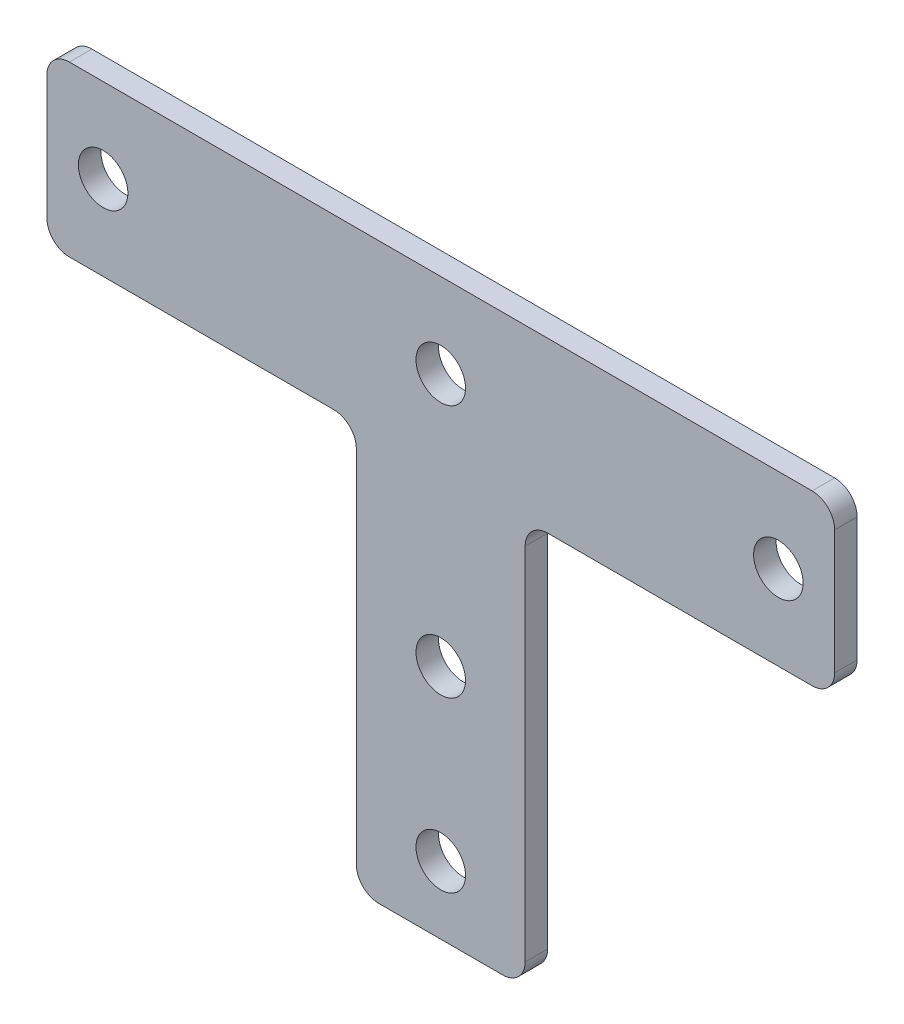
ISO-10303-21;
HEADER;
FILE_DESCRIPTION(('STEP AP214'),'2;1');
FILE_NAME('part.step','',(''),(''),'','','');
FILE_SCHEMA(('AUTOMOTIVE_DESIGN { 1 0 10303 214 1 1 1 1 }'));
ENDSEC;
DATA;
#1=APPLICATION_CONTEXT('core data for automotive mechanical design processes');
#2=APPLICATION_PROTOCOL_DEFINITION('international standard','automotive_design',2000,#1);
#3=PRODUCT_CONTEXT('',#1,'mechanical');
#4=PRODUCT('Part','Part','',(#3));
#5=PRODUCT_RELATED_PRODUCT_CATEGORY('part','',(#4));
#6=PRODUCT_DEFINITION_FORMATION('','',#4);
#7=PRODUCT_DEFINITION_CONTEXT('part definition',#1,'design');
#8=PRODUCT_DEFINITION('design','',#6,#7);
#9=PRODUCT_DEFINITION_SHAPE('','',#8);
#10=(LENGTH_UNIT() NAMED_UNIT(*) SI_UNIT(.MILLI.,.METRE.));
#11=(NAMED_UNIT(*) PLANE_ANGLE_UNIT() SI_UNIT($,.RADIAN.));
#12=(NAMED_UNIT(*) SI_UNIT($,.STERADIAN.) SOLID_ANGLE_UNIT());
#13=UNCERTAINTY_MEASURE_WITH_UNIT(LENGTH_MEASURE(1.E-05),#10,'distance_accuracy_value','');
#14=(GEOMETRIC_REPRESENTATION_CONTEXT(3) GLOBAL_UNCERTAINTY_ASSIGNED_CONTEXT((#13)) GLOBAL_UNIT_ASSIGNED_CONTEXT((#10,
#11,#12)) REPRESENTATION_CONTEXT('',''));
#15=CARTESIAN_POINT('',(0.,0.,0.));
#16=DIRECTION('',(0.,0.,1.));
#17=DIRECTION('',(1.,0.,0.));
#18=AXIS2_PLACEMENT_3D('',#15,#16,#17);
#19=CARTESIAN_POINT('',(0.,-15.,2.));
#20=DIRECTION('',(0.,1.,0.));
#21=DIRECTION('',(0.,0.,1.));
#22=AXIS2_PLACEMENT_3D('',#19,#20,#21);
#23=PLANE('',#22);
#24=DIRECTION('',(1.,0.,0.));
#25=VECTOR('',#24,1.);
#26=CARTESIAN_POINT('',(0.,-15.,2.));
#27=LINE('',#26,#25);
#28=CARTESIAN_POINT('',(2.,-15.,2.));
#29=VERTEX_POINT('',#28);
#30=CARTESIAN_POINT('',(25.5,-15.,2.));
#31=VERTEX_POINT('',#30);
#32=EDGE_CURVE('E322',#29,#31,#27,.T.);
#33=ORIENTED_EDGE('',*,*,#32,.F.);
#34=DIRECTION('',(0.,0.,-1.));
#35=VECTOR('',#34,1.);
#36=CARTESIAN_POINT('',(2.,-15.,2.));
#37=LINE('',#36,#35);
#38=CARTESIAN_POINT('',(2.,-15.,0.));
#39=VERTEX_POINT('',#38);
#40=EDGE_CURVE('E241',#29,#39,#37,.T.);
#41=ORIENTED_EDGE('',*,*,#40,.T.);
#42=DIRECTION('',(1.,0.,0.));
#43=VECTOR('',#42,1.);
#44=CARTESIAN_POINT('',(0.,-15.,0.));
#45=LINE('',#44,#43);
#46=CARTESIAN_POINT('',(25.5,-15.,0.));
#47=VERTEX_POINT('',#46);
#48=EDGE_CURVE('E296',#39,#47,#45,.T.);
#49=ORIENTED_EDGE('',*,*,#48,.T.);
#50=DIRECTION('',(0.,0.,-1.));
#51=VECTOR('',#50,1.);
#52=CARTESIAN_POINT('',(25.5,-15.,2.));
#53=LINE('',#52,#51);
#54=EDGE_CURVE('E243',#47,#31,#53,.F.);
#55=ORIENTED_EDGE('',*,*,#54,.T.);
#56=EDGE_LOOP('',(#33,#41,#49,#55));
#57=FACE_BOUND('',#56,.T.);
#58=ADVANCED_FACE('F42',(#57),#23,.F.);
#59=CARTESIAN_POINT('',(27.5,0.,2.));
#60=DIRECTION('',(1.,0.,0.));
#61=DIRECTION('',(0.,1.,0.));
#62=AXIS2_PLACEMENT_3D('',#59,#60,#61);
#63=PLANE('',#62);
#64=DIRECTION('',(0.,-1.,0.));
#65=VECTOR('',#64,1.);
#66=CARTESIAN_POINT('',(27.5,0.,0.));
#67=LINE('',#66,#65);
#68=CARTESIAN_POINT('',(27.5,-17.,0.));
#69=VERTEX_POINT('',#68);
#70=CARTESIAN_POINT('',(27.5,-49.,0.));
#71=VERTEX_POINT('',#70);
#72=EDGE_CURVE('E301',#69,#71,#67,.T.);
#73=ORIENTED_EDGE('',*,*,#72,.T.);
#74=DIRECTION('',(0.,0.,-1.));
#75=VECTOR('',#74,1.);
#76=CARTESIAN_POINT('',(27.5,-49.,2.));
#77=LINE('',#76,#75);
#78=CARTESIAN_POINT('',(27.5,-49.,2.));
#79=VERTEX_POINT('',#78);
#80=EDGE_CURVE('E231',#71,#79,#77,.F.);
#81=ORIENTED_EDGE('',*,*,#80,.T.);
#82=DIRECTION('',(0.,-1.,0.));
#83=VECTOR('',#82,1.);
#84=CARTESIAN_POINT('',(27.5,0.,2.));
#85=LINE('',#84,#83);
#86=CARTESIAN_POINT('',(27.5,-17.,2.));
#87=VERTEX_POINT('',#86);
#88=EDGE_CURVE('E328',#87,#79,#85,.T.);
#89=ORIENTED_EDGE('',*,*,#88,.F.);
#90=DIRECTION('',(0.,0.,-1.));
#91=VECTOR('',#90,1.);
#92=CARTESIAN_POINT('',(27.5,-17.,0.));
#93=LINE('',#92,#91);
#94=EDGE_CURVE('E234',#87,#69,#93,.T.);
#95=ORIENTED_EDGE('',*,*,#94,.T.);
#96=EDGE_LOOP('',(#73,#81,#89,#95));
#97=FACE_BOUND('',#96,.T.);
#98=ADVANCED_FACE('F349',(#97),#63,.F.);
#99=CARTESIAN_POINT('',(0.,-51.,2.));
#100=DIRECTION('',(0.,1.,0.));
#101=DIRECTION('',(0.,0.,1.));
#102=AXIS2_PLACEMENT_3D('',#99,#100,#101);
#103=PLANE('',#102);
#104=DIRECTION('',(1.,0.,0.));
#105=VECTOR('',#104,1.);
#106=CARTESIAN_POINT('',(0.,-51.,0.));
#107=LINE('',#106,#105);
#108=CARTESIAN_POINT('',(29.5,-51.,0.));
#109=VERTEX_POINT('',#108);
#110=CARTESIAN_POINT('',(40.5,-51.,0.));
#111=VERTEX_POINT('',#110);
#112=EDGE_CURVE('E265',#109,#111,#107,.T.);
#113=ORIENTED_EDGE('',*,*,#112,.T.);
#114=DIRECTION('',(0.,0.,-1.));
#115=VECTOR('',#114,1.);
#116=CARTESIAN_POINT('',(40.5,-51.,2.));
#117=LINE('',#116,#115);
#118=CARTESIAN_POINT('',(40.5,-51.,2.));
#119=VERTEX_POINT('',#118);
#120=EDGE_CURVE('E227',#111,#119,#117,.F.);
#121=ORIENTED_EDGE('',*,*,#120,.T.);
#122=DIRECTION('',(1.,0.,0.));
#123=VECTOR('',#122,1.);
#124=CARTESIAN_POINT('',(0.,-51.,2.));
#125=LINE('',#124,#123);
#126=CARTESIAN_POINT('',(29.5,-51.,2.));
#127=VERTEX_POINT('',#126);
#128=EDGE_CURVE('E276',#127,#119,#125,.T.);
#129=ORIENTED_EDGE('',*,*,#128,.F.);
#130=DIRECTION('',(0.,0.,-1.));
#131=VECTOR('',#130,1.);
#132=CARTESIAN_POINT('',(29.5,-51.,2.));
#133=LINE('',#132,#131);
#134=EDGE_CURVE('E230',#127,#109,#133,.T.);
#135=ORIENTED_EDGE('',*,*,#134,.T.);
#136=EDGE_LOOP('',(#113,#121,#129,#135));
#137=FACE_BOUND('',#136,.T.);
#138=ADVANCED_FACE('F342',(#137),#103,.F.);
#139=CARTESIAN_POINT('',(42.5,0.,2.));
#140=DIRECTION('',(1.,0.,0.));
#141=DIRECTION('',(0.,1.,0.));
#142=AXIS2_PLACEMENT_3D('',#139,#140,#141);
#143=PLANE('',#142);
#144=DIRECTION('',(0.,-1.,0.));
#145=VECTOR('',#144,1.);
#146=CARTESIAN_POINT('',(42.5,0.,2.));
#147=LINE('',#146,#145);
#148=CARTESIAN_POINT('',(42.5,-17.,2.));
#149=VERTEX_POINT('',#148);
#150=CARTESIAN_POINT('',(42.5,-49.,2.));
#151=VERTEX_POINT('',#150);
#152=EDGE_CURVE('E271',#149,#151,#147,.T.);
#153=ORIENTED_EDGE('',*,*,#152,.T.);
#154=DIRECTION('',(0.,0.,-1.));
#155=VECTOR('',#154,1.);
#156=CARTESIAN_POINT('',(42.5,-49.,0.));
#157=LINE('',#156,#155);
#158=CARTESIAN_POINT('',(42.5,-49.,0.));
#159=VERTEX_POINT('',#158);
#160=EDGE_CURVE('E221',#151,#159,#157,.T.);
#161=ORIENTED_EDGE('',*,*,#160,.T.);
#162=DIRECTION('',(0.,-1.,0.));
#163=VECTOR('',#162,1.);
#164=CARTESIAN_POINT('',(42.5,0.,0.));
#165=LINE('',#164,#163);
#166=CARTESIAN_POINT('',(42.5,-17.,0.));
#167=VERTEX_POINT('',#166);
#168=EDGE_CURVE('E252',#167,#159,#165,.T.);
#169=ORIENTED_EDGE('',*,*,#168,.F.);
#170=DIRECTION('',(0.,0.,-1.));
#171=VECTOR('',#170,1.);
#172=CARTESIAN_POINT('',(42.5,-17.,2.));
#173=LINE('',#172,#171);
#174=EDGE_CURVE('E225',#167,#149,#173,.F.);
#175=ORIENTED_EDGE('',*,*,#174,.T.);
#176=EDGE_LOOP('',(#153,#161,#169,#175));
#177=FACE_BOUND('',#176,.T.);
#178=ADVANCED_FACE('F259',(#177),#143,.T.);
#179=CARTESIAN_POINT('',(0.,-15.,2.));
#180=DIRECTION('',(0.,1.,0.));
#181=DIRECTION('',(0.,0.,1.));
#182=AXIS2_PLACEMENT_3D('',#179,#180,#181);
#183=PLANE('',#182);
#184=DIRECTION('',(1.,0.,0.));
#185=VECTOR('',#184,1.);
#186=CARTESIAN_POINT('',(0.,-15.,0.));
#187=LINE('',#186,#185);
#188=CARTESIAN_POINT('',(44.5,-15.,0.));
#189=VERTEX_POINT('',#188);
#190=CARTESIAN_POINT('',(68.,-15.,0.));
#191=VERTEX_POINT('',#190);
#192=EDGE_CURVE('E176',#189,#191,#187,.T.);
#193=ORIENTED_EDGE('',*,*,#192,.T.);
#194=DIRECTION('',(0.,0.,-1.));
#195=VECTOR('',#194,1.);
#196=CARTESIAN_POINT('',(68.,-15.,2.));
#197=LINE('',#196,#195);
#198=CARTESIAN_POINT('',(68.,-15.,2.));
#199=VERTEX_POINT('',#198);
#200=EDGE_CURVE('E206',#191,#199,#197,.F.);
#201=ORIENTED_EDGE('',*,*,#200,.T.);
#202=DIRECTION('',(1.,0.,0.));
#203=VECTOR('',#202,1.);
#204=CARTESIAN_POINT('',(0.,-15.,2.));
#205=LINE('',#204,#203);
#206=CARTESIAN_POINT('',(44.5,-15.,2.));
#207=VERTEX_POINT('',#206);
#208=EDGE_CURVE('E267',#207,#199,#205,.T.);
#209=ORIENTED_EDGE('',*,*,#208,.F.);
#210=DIRECTION('',(0.,0.,-1.));
#211=VECTOR('',#210,1.);
#212=CARTESIAN_POINT('',(44.5,-15.,2.));
#213=LINE('',#212,#211);
#214=EDGE_CURVE('E201',#207,#189,#213,.T.);
#215=ORIENTED_EDGE('',*,*,#214,.T.);
#216=EDGE_LOOP('',(#193,#201,#209,#215));
#217=FACE_BOUND('',#216,.T.);
#218=ADVANCED_FACE('F272',(#217),#183,.F.);
#219=CARTESIAN_POINT('',(70.,0.,2.));
#220=DIRECTION('',(1.,0.,0.));
#221=DIRECTION('',(0.,0.,-1.));
#222=AXIS2_PLACEMENT_3D('',#219,#220,#221);
#223=PLANE('',#222);
#224=DIRECTION('',(0.,-1.,0.));
#225=VECTOR('',#224,1.);
#226=CARTESIAN_POINT('',(70.,0.,2.));
#227=LINE('',#226,#225);
#228=CARTESIAN_POINT('',(70.,-2.,2.));
#229=VERTEX_POINT('',#228);
#230=CARTESIAN_POINT('',(70.,-13.,2.));
#231=VERTEX_POINT('',#230);
#232=EDGE_CURVE('E274',#229,#231,#227,.T.);
#233=ORIENTED_EDGE('',*,*,#232,.T.);
#234=DIRECTION('',(0.,0.,-1.));
#235=VECTOR('',#234,1.);
#236=CARTESIAN_POINT('',(70.,-13.,0.));
#237=LINE('',#236,#235);
#238=CARTESIAN_POINT('',(70.,-13.,0.));
#239=VERTEX_POINT('',#238);
#240=EDGE_CURVE('E180',#231,#239,#237,.T.);
#241=ORIENTED_EDGE('',*,*,#240,.T.);
#242=DIRECTION('',(0.,-1.,0.));
#243=VECTOR('',#242,1.);
#244=CARTESIAN_POINT('',(70.,0.,0.));
#245=LINE('',#244,#243);
#246=CARTESIAN_POINT('',(70.,-2.,0.));
#247=VERTEX_POINT('',#246);
#248=EDGE_CURVE('E165',#247,#239,#245,.T.);
#249=ORIENTED_EDGE('',*,*,#248,.F.);
#250=DIRECTION('',(0.,0.,-1.));
#251=VECTOR('',#250,1.);
#252=CARTESIAN_POINT('',(70.,-2.,2.));
#253=LINE('',#252,#251);
#254=EDGE_CURVE('E178',#247,#229,#253,.F.);
#255=ORIENTED_EDGE('',*,*,#254,.T.);
#256=EDGE_LOOP('',(#233,#241,#249,#255));
#257=FACE_BOUND('',#256,.T.);
#258=ADVANCED_FACE('F172',(#257),#223,.T.);
#259=CARTESIAN_POINT('',(0.,0.,2.));
#260=DIRECTION('',(0.,1.,0.));
#261=DIRECTION('',(0.,0.,1.));
#262=AXIS2_PLACEMENT_3D('',#259,#260,#261);
#263=PLANE('',#262);
#264=DIRECTION('',(1.,0.,0.));
#265=VECTOR('',#264,1.);
#266=CARTESIAN_POINT('',(0.,0.,2.));
#267=LINE('',#266,#265);
#268=CARTESIAN_POINT('',(2.,0.,2.));
#269=VERTEX_POINT('',#268);
#270=CARTESIAN_POINT('',(68.,0.,2.));
#271=VERTEX_POINT('',#270);
#272=EDGE_CURVE('E280',#269,#271,#267,.T.);
#273=ORIENTED_EDGE('',*,*,#272,.T.);
#274=DIRECTION('',(0.,0.,-1.));
#275=VECTOR('',#274,1.);
#276=CARTESIAN_POINT('',(68.,0.,2.));
#277=LINE('',#276,#275);
#278=CARTESIAN_POINT('',(68.,0.,0.));
#279=VERTEX_POINT('',#278);
#280=EDGE_CURVE('E219',#271,#279,#277,.T.);
#281=ORIENTED_EDGE('',*,*,#280,.T.);
#282=DIRECTION('',(1.,0.,0.));
#283=VECTOR('',#282,1.);
#284=CARTESIAN_POINT('',(0.,0.,0.));
#285=LINE('',#284,#283);
#286=CARTESIAN_POINT('',(2.,0.,0.));
#287=VERTEX_POINT('',#286);
#288=EDGE_CURVE('E163',#287,#279,#285,.T.);
#289=ORIENTED_EDGE('',*,*,#288,.F.);
#290=DIRECTION('',(0.,0.,-1.));
#291=VECTOR('',#290,1.);
#292=CARTESIAN_POINT('',(2.,0.,2.));
#293=LINE('',#292,#291);
#294=EDGE_CURVE('E217',#287,#269,#293,.F.);
#295=ORIENTED_EDGE('',*,*,#294,.T.);
#296=EDGE_LOOP('',(#273,#281,#289,#295));
#297=FACE_BOUND('',#296,.T.);
#298=ADVANCED_FACE('F367',(#297),#263,.T.);
#299=CARTESIAN_POINT('',(35.,-30.,2.));
#300=DIRECTION('',(0.,0.,-1.));
#301=DIRECTION('',(-1.,0.,0.));
#302=AXIS2_PLACEMENT_3D('',#299,#300,#301);
#303=CYLINDRICAL_SURFACE('',#302,2.2);
#304=CARTESIAN_POINT('',(35.,-30.,2.));
#305=DIRECTION('',(0.,0.,1.));
#306=DIRECTION('',(1.,0.,0.));
#307=AXIS2_PLACEMENT_3D('',#304,#305,#306);
#308=CIRCLE('',#307,2.2);
#309=CARTESIAN_POINT('',(37.2,-30.,2.));
#310=VERTEX_POINT('',#309);
#311=EDGE_CURVE('E187',#310,#310,#308,.T.);
#312=ORIENTED_EDGE('',*,*,#311,.T.);
#313=EDGE_LOOP('',(#312));
#314=FACE_BOUND('',#313,.T.);
#315=CARTESIAN_POINT('',(35.,-30.,0.));
#316=DIRECTION('',(0.,0.,1.));
#317=DIRECTION('',(1.,0.,0.));
#318=AXIS2_PLACEMENT_3D('',#315,#316,#317);
#319=CIRCLE('',#318,2.2);
#320=CARTESIAN_POINT('',(37.2,-30.,0.));
#321=VERTEX_POINT('',#320);
#322=EDGE_CURVE('E312',#321,#321,#319,.T.);
#323=ORIENTED_EDGE('',*,*,#322,.F.);
#324=EDGE_LOOP('',(#323));
#325=FACE_BOUND('',#324,.T.);
#326=ADVANCED_FACE('F413',(#314,#325),#303,.F.);
#327=CARTESIAN_POINT('',(35.,-45.,2.));
#328=DIRECTION('',(0.,0.,-1.));
#329=DIRECTION('',(-1.,0.,0.));
#330=AXIS2_PLACEMENT_3D('',#327,#328,#329);
#331=CYLINDRICAL_SURFACE('',#330,2.2);
#332=CARTESIAN_POINT('',(35.,-45.,2.));
#333=DIRECTION('',(0.,0.,1.));
#334=DIRECTION('',(1.,0.,0.));
#335=AXIS2_PLACEMENT_3D('',#332,#333,#334);
#336=CIRCLE('',#335,2.2);
#337=CARTESIAN_POINT('',(37.2,-45.,2.));
#338=VERTEX_POINT('',#337);
#339=EDGE_CURVE('E286',#338,#338,#336,.T.);
#340=ORIENTED_EDGE('',*,*,#339,.T.);
#341=EDGE_LOOP('',(#340));
#342=FACE_BOUND('',#341,.T.);
#343=CARTESIAN_POINT('',(35.,-45.,0.));
#344=DIRECTION('',(0.,0.,1.));
#345=DIRECTION('',(1.,0.,0.));
#346=AXIS2_PLACEMENT_3D('',#343,#344,#345);
#347=CIRCLE('',#346,2.2);
#348=CARTESIAN_POINT('',(37.2,-45.,0.));
#349=VERTEX_POINT('',#348);
#350=EDGE_CURVE('E311',#349,#349,#347,.T.);
#351=ORIENTED_EDGE('',*,*,#350,.F.);
#352=EDGE_LOOP('',(#351));
#353=FACE_BOUND('',#352,.T.);
#354=ADVANCED_FACE('F406',(#342,#353),#331,.F.);
#355=CARTESIAN_POINT('',(35.,-7.5,2.));
#356=DIRECTION('',(0.,0.,-1.));
#357=DIRECTION('',(-1.,0.,0.));
#358=AXIS2_PLACEMENT_3D('',#355,#356,#357);
#359=CYLINDRICAL_SURFACE('',#358,2.2);
#360=CARTESIAN_POINT('',(35.,-7.5,2.));
#361=DIRECTION('',(0.,0.,1.));
#362=DIRECTION('',(1.,0.,0.));
#363=AXIS2_PLACEMENT_3D('',#360,#361,#362);
#364=CIRCLE('',#363,2.2);
#365=CARTESIAN_POINT('',(37.2,-7.5,2.));
#366=VERTEX_POINT('',#365);
#367=EDGE_CURVE('E289',#366,#366,#364,.T.);
#368=ORIENTED_EDGE('',*,*,#367,.T.);
#369=EDGE_LOOP('',(#368));
#370=FACE_BOUND('',#369,.T.);
#371=CARTESIAN_POINT('',(35.,-7.5,0.));
#372=DIRECTION('',(0.,0.,1.));
#373=DIRECTION('',(1.,0.,0.));
#374=AXIS2_PLACEMENT_3D('',#371,#372,#373);
#375=CIRCLE('',#374,2.2);
#376=CARTESIAN_POINT('',(37.2,-7.5,0.));
#377=VERTEX_POINT('',#376);
#378=EDGE_CURVE('E309',#377,#377,#375,.T.);
#379=ORIENTED_EDGE('',*,*,#378,.F.);
#380=EDGE_LOOP('',(#379));
#381=FACE_BOUND('',#380,.T.);
#382=ADVANCED_FACE('F396',(#370,#381),#359,.F.);
#383=CARTESIAN_POINT('',(0.,0.,2.));
#384=DIRECTION('',(1.,0.,0.));
#385=DIRECTION('',(0.,1.,0.));
#386=AXIS2_PLACEMENT_3D('',#383,#384,#385);
#387=PLANE('',#386);
#388=DIRECTION('',(0.,-1.,0.));
#389=VECTOR('',#388,1.);
#390=CARTESIAN_POINT('',(0.,0.,2.));
#391=LINE('',#390,#389);
#392=CARTESIAN_POINT('',(0.,-2.,2.));
#393=VERTEX_POINT('',#392);
#394=CARTESIAN_POINT('',(0.,-13.,2.));
#395=VERTEX_POINT('',#394);
#396=EDGE_CURVE('E282',#393,#395,#391,.T.);
#397=ORIENTED_EDGE('',*,*,#396,.F.);
#398=DIRECTION('',(0.,0.,-1.));
#399=VECTOR('',#398,1.);
#400=CARTESIAN_POINT('',(0.,-2.,0.));
#401=LINE('',#400,#399);
#402=CARTESIAN_POINT('',(0.,-2.,0.));
#403=VERTEX_POINT('',#402);
#404=EDGE_CURVE('E236',#393,#403,#401,.T.);
#405=ORIENTED_EDGE('',*,*,#404,.T.);
#406=DIRECTION('',(0.,-1.,0.));
#407=VECTOR('',#406,1.);
#408=CARTESIAN_POINT('',(0.,0.,0.));
#409=LINE('',#408,#407);
#410=CARTESIAN_POINT('',(0.,-13.,0.));
#411=VERTEX_POINT('',#410);
#412=EDGE_CURVE('E306',#403,#411,#409,.T.);
#413=ORIENTED_EDGE('',*,*,#412,.T.);
#414=DIRECTION('',(0.,0.,-1.));
#415=VECTOR('',#414,1.);
#416=CARTESIAN_POINT('',(0.,-13.,2.));
#417=LINE('',#416,#415);
#418=EDGE_CURVE('E56',#411,#395,#417,.F.);
#419=ORIENTED_EDGE('',*,*,#418,.T.);
#420=EDGE_LOOP('',(#397,#405,#413,#419));
#421=FACE_BOUND('',#420,.T.);
#422=ADVANCED_FACE('F365',(#421),#387,.F.);
#423=CARTESIAN_POINT('',(5.,-7.5,2.));
#424=DIRECTION('',(0.,0.,-1.));
#425=DIRECTION('',(-1.,0.,0.));
#426=AXIS2_PLACEMENT_3D('',#423,#424,#425);
#427=CYLINDRICAL_SURFACE('',#426,2.2);
#428=CARTESIAN_POINT('',(5.,-7.5,2.));
#429=DIRECTION('',(0.,0.,1.));
#430=DIRECTION('',(1.,0.,0.));
#431=AXIS2_PLACEMENT_3D('',#428,#429,#430);
#432=CIRCLE('',#431,2.2);
#433=CARTESIAN_POINT('',(7.2,-7.5,2.));
#434=VERTEX_POINT('',#433);
#435=EDGE_CURVE('E319',#434,#434,#432,.T.);
#436=ORIENTED_EDGE('',*,*,#435,.T.);
#437=EDGE_LOOP('',(#436));
#438=FACE_BOUND('',#437,.T.);
#439=CARTESIAN_POINT('',(5.,-7.5,0.));
#440=DIRECTION('',(0.,0.,1.));
#441=DIRECTION('',(1.,0.,0.));
#442=AXIS2_PLACEMENT_3D('',#439,#440,#441);
#443=CIRCLE('',#442,2.2);
#444=CARTESIAN_POINT('',(7.2,-7.5,0.));
#445=VERTEX_POINT('',#444);
#446=EDGE_CURVE('E293',#445,#445,#443,.T.);
#447=ORIENTED_EDGE('',*,*,#446,.F.);
#448=EDGE_LOOP('',(#447));
#449=FACE_BOUND('',#448,.T.);
#450=ADVANCED_FACE('F393',(#438,#449),#427,.F.);
#451=CARTESIAN_POINT('',(65.,-7.5,2.));
#452=DIRECTION('',(0.,0.,-1.));
#453=DIRECTION('',(-1.,0.,0.));
#454=AXIS2_PLACEMENT_3D('',#451,#452,#453);
#455=CYLINDRICAL_SURFACE('',#454,2.2);
#456=CARTESIAN_POINT('',(65.,-7.5,2.));
#457=DIRECTION('',(0.,0.,1.));
#458=DIRECTION('',(1.,0.,0.));
#459=AXIS2_PLACEMENT_3D('',#456,#457,#458);
#460=CIRCLE('',#459,2.2);
#461=CARTESIAN_POINT('',(67.2,-7.5,2.));
#462=VERTEX_POINT('',#461);
#463=EDGE_CURVE('E183',#462,#462,#460,.T.);
#464=ORIENTED_EDGE('',*,*,#463,.T.);
#465=EDGE_LOOP('',(#464));
#466=FACE_BOUND('',#465,.T.);
#467=CARTESIAN_POINT('',(65.,-7.5,0.));
#468=DIRECTION('',(0.,0.,1.));
#469=DIRECTION('',(1.,0.,0.));
#470=AXIS2_PLACEMENT_3D('',#467,#468,#469);
#471=CIRCLE('',#470,2.2);
#472=CARTESIAN_POINT('',(67.2,-7.5,0.));
#473=VERTEX_POINT('',#472);
#474=EDGE_CURVE('E192',#473,#473,#471,.T.);
#475=ORIENTED_EDGE('',*,*,#474,.F.);
#476=EDGE_LOOP('',(#475));
#477=FACE_BOUND('',#476,.T.);
#478=ADVANCED_FACE('F391',(#466,#477),#455,.F.);
#479=CARTESIAN_POINT('',(0.,0.,2.));
#480=DIRECTION('',(0.,0.,1.));
#481=DIRECTION('',(1.,0.,0.));
#482=AXIS2_PLACEMENT_3D('',#479,#480,#481);
#483=PLANE('',#482);
#484=ORIENTED_EDGE('',*,*,#435,.F.);
#485=EDGE_LOOP('',(#484));
#486=FACE_BOUND('',#485,.T.);
#487=ORIENTED_EDGE('',*,*,#208,.T.);
#488=CARTESIAN_POINT('',(68.,-13.,2.));
#489=DIRECTION('',(0.,0.,1.));
#490=DIRECTION('',(1.,0.,0.));
#491=AXIS2_PLACEMENT_3D('',#488,#489,#490);
#492=CIRCLE('',#491,2.);
#493=EDGE_CURVE('E216',#199,#231,#492,.T.);
#494=ORIENTED_EDGE('',*,*,#493,.T.);
#495=ORIENTED_EDGE('',*,*,#232,.F.);
#496=CARTESIAN_POINT('',(68.,-2.,2.));
#497=DIRECTION('',(0.,0.,1.));
#498=DIRECTION('',(1.,0.,0.));
#499=AXIS2_PLACEMENT_3D('',#496,#497,#498);
#500=CIRCLE('',#499,2.);
#501=EDGE_CURVE('E184',#229,#271,#500,.T.);
#502=ORIENTED_EDGE('',*,*,#501,.T.);
#503=ORIENTED_EDGE('',*,*,#272,.F.);
#504=CARTESIAN_POINT('',(2.,-2.,2.));
#505=DIRECTION('',(0.,0.,1.));
#506=DIRECTION('',(1.,0.,0.));
#507=AXIS2_PLACEMENT_3D('',#504,#505,#506);
#508=CIRCLE('',#507,2.);
#509=EDGE_CURVE('E68',#269,#393,#508,.T.);
#510=ORIENTED_EDGE('',*,*,#509,.T.);
#511=ORIENTED_EDGE('',*,*,#396,.T.);
#512=CARTESIAN_POINT('',(2.,-13.,2.));
#513=DIRECTION('',(0.,0.,1.));
#514=DIRECTION('',(1.,0.,0.));
#515=AXIS2_PLACEMENT_3D('',#512,#513,#514);
#516=CIRCLE('',#515,2.);
#517=EDGE_CURVE('E208',#395,#29,#516,.T.);
#518=ORIENTED_EDGE('',*,*,#517,.T.);
#519=ORIENTED_EDGE('',*,*,#32,.T.);
#520=CARTESIAN_POINT('',(25.5,-17.,2.));
#521=DIRECTION('',(0.,0.,1.));
#522=DIRECTION('',(1.,0.,0.));
#523=AXIS2_PLACEMENT_3D('',#520,#521,#522);
#524=CIRCLE('',#523,2.);
#525=EDGE_CURVE('E247',#31,#87,#524,.F.);
#526=ORIENTED_EDGE('',*,*,#525,.T.);
#527=ORIENTED_EDGE('',*,*,#88,.T.);
#528=CARTESIAN_POINT('',(29.5,-49.,2.));
#529=DIRECTION('',(0.,0.,1.));
#530=DIRECTION('',(1.,0.,0.));
#531=AXIS2_PLACEMENT_3D('',#528,#529,#530);
#532=CIRCLE('',#531,2.);
#533=EDGE_CURVE('E211',#79,#127,#532,.T.);
#534=ORIENTED_EDGE('',*,*,#533,.T.);
#535=ORIENTED_EDGE('',*,*,#128,.T.);
#536=CARTESIAN_POINT('',(40.5,-49.,2.));
#537=DIRECTION('',(0.,0.,1.));
#538=DIRECTION('',(1.,0.,0.));
#539=AXIS2_PLACEMENT_3D('',#536,#537,#538);
#540=CIRCLE('',#539,2.);
#541=EDGE_CURVE('E213',#119,#151,#540,.T.);
#542=ORIENTED_EDGE('',*,*,#541,.T.);
#543=ORIENTED_EDGE('',*,*,#152,.F.);
#544=CARTESIAN_POINT('',(44.5,-17.,2.));
#545=DIRECTION('',(0.,0.,1.));
#546=DIRECTION('',(1.,0.,0.));
#547=AXIS2_PLACEMENT_3D('',#544,#545,#546);
#548=CIRCLE('',#547,2.);
#549=EDGE_CURVE('E11',#149,#207,#548,.F.);
#550=ORIENTED_EDGE('',*,*,#549,.T.);
#551=EDGE_LOOP('',(#487,#494,#495,#502,#503,#510,#511,#518,#519,#526,#527,#534,#535,#542,#543,#550));
#552=FACE_BOUND('',#551,.T.);
#553=ORIENTED_EDGE('',*,*,#367,.F.);
#554=EDGE_LOOP('',(#553));
#555=FACE_BOUND('',#554,.T.);
#556=ORIENTED_EDGE('',*,*,#339,.F.);
#557=EDGE_LOOP('',(#556));
#558=FACE_BOUND('',#557,.T.);
#559=ORIENTED_EDGE('',*,*,#311,.F.);
#560=EDGE_LOOP('',(#559));
#561=FACE_BOUND('',#560,.T.);
#562=ORIENTED_EDGE('',*,*,#463,.F.);
#563=EDGE_LOOP('',(#562));
#564=FACE_BOUND('',#563,.T.);
#565=ADVANCED_FACE('F270',(#486,#552,#555,#558,#561,#564),#483,.T.);
#566=CARTESIAN_POINT('',(0.,0.,0.));
#567=DIRECTION('',(0.,0.,1.));
#568=DIRECTION('',(1.,0.,0.));
#569=AXIS2_PLACEMENT_3D('',#566,#567,#568);
#570=PLANE('',#569);
#571=ORIENTED_EDGE('',*,*,#446,.T.);
#572=EDGE_LOOP('',(#571));
#573=FACE_BOUND('',#572,.T.);
#574=ORIENTED_EDGE('',*,*,#248,.T.);
#575=CARTESIAN_POINT('',(68.,-13.,0.));
#576=DIRECTION('',(0.,0.,1.));
#577=DIRECTION('',(1.,0.,0.));
#578=AXIS2_PLACEMENT_3D('',#575,#576,#577);
#579=CIRCLE('',#578,2.);
#580=EDGE_CURVE('E166',#239,#191,#579,.F.);
#581=ORIENTED_EDGE('',*,*,#580,.T.);
#582=ORIENTED_EDGE('',*,*,#192,.F.);
#583=CARTESIAN_POINT('',(44.5,-17.,0.));
#584=DIRECTION('',(0.,0.,1.));
#585=DIRECTION('',(1.,0.,0.));
#586=AXIS2_PLACEMENT_3D('',#583,#584,#585);
#587=CIRCLE('',#586,2.);
#588=EDGE_CURVE('E55',#189,#167,#587,.T.);
#589=ORIENTED_EDGE('',*,*,#588,.T.);
#590=ORIENTED_EDGE('',*,*,#168,.T.);
#591=CARTESIAN_POINT('',(40.5,-49.,0.));
#592=DIRECTION('',(0.,0.,1.));
#593=DIRECTION('',(1.,0.,0.));
#594=AXIS2_PLACEMENT_3D('',#591,#592,#593);
#595=CIRCLE('',#594,2.);
#596=EDGE_CURVE('E168',#159,#111,#595,.F.);
#597=ORIENTED_EDGE('',*,*,#596,.T.);
#598=ORIENTED_EDGE('',*,*,#112,.F.);
#599=CARTESIAN_POINT('',(29.5,-49.,0.));
#600=DIRECTION('',(0.,0.,1.));
#601=DIRECTION('',(1.,0.,0.));
#602=AXIS2_PLACEMENT_3D('',#599,#600,#601);
#603=CIRCLE('',#602,2.);
#604=EDGE_CURVE('E200',#109,#71,#603,.F.);
#605=ORIENTED_EDGE('',*,*,#604,.T.);
#606=ORIENTED_EDGE('',*,*,#72,.F.);
#607=CARTESIAN_POINT('',(25.5,-17.,0.));
#608=DIRECTION('',(0.,0.,1.));
#609=DIRECTION('',(1.,0.,0.));
#610=AXIS2_PLACEMENT_3D('',#607,#608,#609);
#611=CIRCLE('',#610,2.);
#612=EDGE_CURVE('E246',#69,#47,#611,.T.);
#613=ORIENTED_EDGE('',*,*,#612,.T.);
#614=ORIENTED_EDGE('',*,*,#48,.F.);
#615=CARTESIAN_POINT('',(2.,-13.,0.));
#616=DIRECTION('',(0.,0.,1.));
#617=DIRECTION('',(1.,0.,0.));
#618=AXIS2_PLACEMENT_3D('',#615,#616,#617);
#619=CIRCLE('',#618,2.);
#620=EDGE_CURVE('E190',#39,#411,#619,.F.);
#621=ORIENTED_EDGE('',*,*,#620,.T.);
#622=ORIENTED_EDGE('',*,*,#412,.F.);
#623=CARTESIAN_POINT('',(2.,-2.,0.));
#624=DIRECTION('',(0.,0.,1.));
#625=DIRECTION('',(1.,0.,0.));
#626=AXIS2_PLACEMENT_3D('',#623,#624,#625);
#627=CIRCLE('',#626,2.);
#628=EDGE_CURVE('E197',#403,#287,#627,.F.);
#629=ORIENTED_EDGE('',*,*,#628,.T.);
#630=ORIENTED_EDGE('',*,*,#288,.T.);
#631=CARTESIAN_POINT('',(68.,-2.,0.));
#632=DIRECTION('',(0.,0.,1.));
#633=DIRECTION('',(1.,0.,0.));
#634=AXIS2_PLACEMENT_3D('',#631,#632,#633);
#635=CIRCLE('',#634,2.);
#636=EDGE_CURVE('E158',#279,#247,#635,.F.);
#637=ORIENTED_EDGE('',*,*,#636,.T.);
#638=EDGE_LOOP('',(#574,#581,#582,#589,#590,#597,#598,#605,#606,#613,#614,#621,#622,#629,#630,#637));
#639=FACE_BOUND('',#638,.T.);
#640=ORIENTED_EDGE('',*,*,#378,.T.);
#641=EDGE_LOOP('',(#640));
#642=FACE_BOUND('',#641,.T.);
#643=ORIENTED_EDGE('',*,*,#350,.T.);
#644=EDGE_LOOP('',(#643));
#645=FACE_BOUND('',#644,.T.);
#646=ORIENTED_EDGE('',*,*,#322,.T.);
#647=EDGE_LOOP('',(#646));
#648=FACE_BOUND('',#647,.T.);
#649=ORIENTED_EDGE('',*,*,#474,.T.);
#650=EDGE_LOOP('',(#649));
#651=FACE_BOUND('',#650,.T.);
#652=ADVANCED_FACE('F159',(#573,#639,#642,#645,#648,#651),#570,.F.);
#653=CARTESIAN_POINT('',(68.,-13.,2.));
#654=DIRECTION('',(0.,0.,1.));
#655=DIRECTION('',(1.,0.,0.));
#656=AXIS2_PLACEMENT_3D('',#653,#654,#655);
#657=CYLINDRICAL_SURFACE('',#656,2.);
#658=ORIENTED_EDGE('',*,*,#493,.F.);
#659=ORIENTED_EDGE('',*,*,#200,.F.);
#660=ORIENTED_EDGE('',*,*,#580,.F.);
#661=ORIENTED_EDGE('',*,*,#240,.F.);
#662=EDGE_LOOP('',(#658,#659,#660,#661));
#663=FACE_BOUND('',#662,.T.);
#664=ADVANCED_FACE('F375',(#663),#657,.T.);
#665=CARTESIAN_POINT('',(68.,-2.,2.));
#666=DIRECTION('',(0.,0.,-1.));
#667=DIRECTION('',(-1.,0.,0.));
#668=AXIS2_PLACEMENT_3D('',#665,#666,#667);
#669=CYLINDRICAL_SURFACE('',#668,2.);
#670=ORIENTED_EDGE('',*,*,#501,.F.);
#671=ORIENTED_EDGE('',*,*,#254,.F.);
#672=ORIENTED_EDGE('',*,*,#636,.F.);
#673=ORIENTED_EDGE('',*,*,#280,.F.);
#674=EDGE_LOOP('',(#670,#671,#672,#673));
#675=FACE_BOUND('',#674,.T.);
#676=ADVANCED_FACE('F181',(#675),#669,.T.);
#677=CARTESIAN_POINT('',(40.5,-49.,2.));
#678=DIRECTION('',(0.,0.,1.));
#679=DIRECTION('',(1.,0.,0.));
#680=AXIS2_PLACEMENT_3D('',#677,#678,#679);
#681=CYLINDRICAL_SURFACE('',#680,2.);
#682=ORIENTED_EDGE('',*,*,#541,.F.);
#683=ORIENTED_EDGE('',*,*,#120,.F.);
#684=ORIENTED_EDGE('',*,*,#596,.F.);
#685=ORIENTED_EDGE('',*,*,#160,.F.);
#686=EDGE_LOOP('',(#682,#683,#684,#685));
#687=FACE_BOUND('',#686,.T.);
#688=ADVANCED_FACE('F343',(#687),#681,.T.);
#689=CARTESIAN_POINT('',(29.5,-49.,2.));
#690=DIRECTION('',(0.,0.,-1.));
#691=DIRECTION('',(-1.,0.,0.));
#692=AXIS2_PLACEMENT_3D('',#689,#690,#691);
#693=CYLINDRICAL_SURFACE('',#692,2.);
#694=ORIENTED_EDGE('',*,*,#533,.F.);
#695=ORIENTED_EDGE('',*,*,#80,.F.);
#696=ORIENTED_EDGE('',*,*,#604,.F.);
#697=ORIENTED_EDGE('',*,*,#134,.F.);
#698=EDGE_LOOP('',(#694,#695,#696,#697));
#699=FACE_BOUND('',#698,.T.);
#700=ADVANCED_FACE('F341',(#699),#693,.T.);
#701=CARTESIAN_POINT('',(2.,-2.,2.));
#702=DIRECTION('',(0.,0.,1.));
#703=DIRECTION('',(1.,0.,0.));
#704=AXIS2_PLACEMENT_3D('',#701,#702,#703);
#705=CYLINDRICAL_SURFACE('',#704,2.);
#706=ORIENTED_EDGE('',*,*,#509,.F.);
#707=ORIENTED_EDGE('',*,*,#294,.F.);
#708=ORIENTED_EDGE('',*,*,#628,.F.);
#709=ORIENTED_EDGE('',*,*,#404,.F.);
#710=EDGE_LOOP('',(#706,#707,#708,#709));
#711=FACE_BOUND('',#710,.T.);
#712=ADVANCED_FACE('F370',(#711),#705,.T.);
#713=CARTESIAN_POINT('',(2.,-13.,2.));
#714=DIRECTION('',(0.,0.,-1.));
#715=DIRECTION('',(-1.,0.,0.));
#716=AXIS2_PLACEMENT_3D('',#713,#714,#715);
#717=CYLINDRICAL_SURFACE('',#716,2.);
#718=ORIENTED_EDGE('',*,*,#517,.F.);
#719=ORIENTED_EDGE('',*,*,#418,.F.);
#720=ORIENTED_EDGE('',*,*,#620,.F.);
#721=ORIENTED_EDGE('',*,*,#40,.F.);
#722=EDGE_LOOP('',(#718,#719,#720,#721));
#723=FACE_BOUND('',#722,.T.);
#724=ADVANCED_FACE('F362',(#723),#717,.T.);
#725=CARTESIAN_POINT('',(25.5,-17.,2.));
#726=DIRECTION('',(0.,0.,1.));
#727=DIRECTION('',(1.,0.,0.));
#728=AXIS2_PLACEMENT_3D('',#725,#726,#727);
#729=CYLINDRICAL_SURFACE('',#728,2.);
#730=ORIENTED_EDGE('',*,*,#525,.F.);
#731=ORIENTED_EDGE('',*,*,#54,.F.);
#732=ORIENTED_EDGE('',*,*,#612,.F.);
#733=ORIENTED_EDGE('',*,*,#94,.F.);
#734=EDGE_LOOP('',(#730,#731,#732,#733));
#735=FACE_BOUND('',#734,.T.);
#736=ADVANCED_FACE('F354',(#735),#729,.F.);
#737=CARTESIAN_POINT('',(44.5,-17.,2.));
#738=DIRECTION('',(0.,0.,-1.));
#739=DIRECTION('',(-1.,0.,0.));
#740=AXIS2_PLACEMENT_3D('',#737,#738,#739);
#741=CYLINDRICAL_SURFACE('',#740,2.);
#742=ORIENTED_EDGE('',*,*,#549,.F.);
#743=ORIENTED_EDGE('',*,*,#174,.F.);
#744=ORIENTED_EDGE('',*,*,#588,.F.);
#745=ORIENTED_EDGE('',*,*,#214,.F.);
#746=EDGE_LOOP('',(#742,#743,#744,#745));
#747=FACE_BOUND('',#746,.T.);
#748=ADVANCED_FACE('F46',(#747),#741,.F.);
#749=CLOSED_SHELL('',(#58,#98,#138,#178,#218,#258,#298,#326,#354,#382,#422,#450,#478,#565,#652,
#664,#676,#688,#700,#712,#724,#736,#748));
#750=MANIFOLD_SOLID_BREP('B2',#749);
#751=ADVANCED_BREP_SHAPE_REPRESENTATION('',(#18,#750),#14);
#752=SHAPE_DEFINITION_REPRESENTATION(#9,#751);
ENDSEC;
END-ISO-10303-21;
